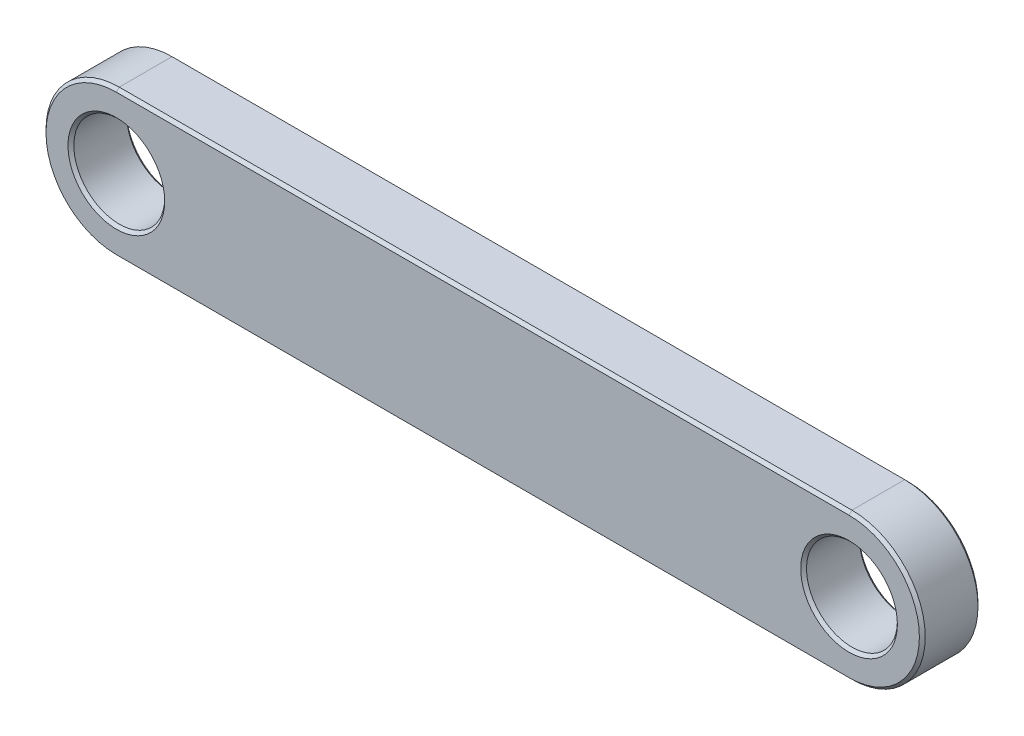
ISO-10303-21;
HEADER;
FILE_DESCRIPTION(('STEP AP214'),'2;1');
FILE_NAME('part.step','',(''),(''),'','','');
FILE_SCHEMA(('AUTOMOTIVE_DESIGN { 1 0 10303 214 1 1 1 1 }'));
ENDSEC;
DATA;
#1=APPLICATION_CONTEXT('core data for automotive mechanical design processes');
#2=APPLICATION_PROTOCOL_DEFINITION('international standard','automotive_design',2000,#1);
#3=PRODUCT_CONTEXT('',#1,'mechanical');
#4=PRODUCT('Part','Part','',(#3));
#5=PRODUCT_RELATED_PRODUCT_CATEGORY('part','',(#4));
#6=PRODUCT_DEFINITION_FORMATION('','',#4);
#7=PRODUCT_DEFINITION_CONTEXT('part definition',#1,'design');
#8=PRODUCT_DEFINITION('design','',#6,#7);
#9=PRODUCT_DEFINITION_SHAPE('','',#8);
#10=(LENGTH_UNIT() NAMED_UNIT(*) SI_UNIT(.MILLI.,.METRE.));
#11=(NAMED_UNIT(*) PLANE_ANGLE_UNIT() SI_UNIT($,.RADIAN.));
#12=(NAMED_UNIT(*) SI_UNIT($,.STERADIAN.) SOLID_ANGLE_UNIT());
#13=UNCERTAINTY_MEASURE_WITH_UNIT(LENGTH_MEASURE(1.E-05),#10,'distance_accuracy_value','');
#14=(GEOMETRIC_REPRESENTATION_CONTEXT(3) GLOBAL_UNCERTAINTY_ASSIGNED_CONTEXT((#13)) GLOBAL_UNIT_ASSIGNED_CONTEXT((#10,
#11,#12)) REPRESENTATION_CONTEXT('',''));
#15=CARTESIAN_POINT('',(0.,0.,0.));
#16=DIRECTION('',(0.,0.,1.));
#17=DIRECTION('',(1.,0.,0.));
#18=AXIS2_PLACEMENT_3D('',#15,#16,#17);
#19=CARTESIAN_POINT('',(-12.5,0.,2.));
#20=DIRECTION('',(0.,0.,1.));
#21=DIRECTION('',(1.,0.,0.));
#22=AXIS2_PLACEMENT_3D('',#19,#20,#21);
#23=PLANE('',#22);
#24=CARTESIAN_POINT('',(12.5,0.,2.));
#25=DIRECTION('',(0.,0.,1.));
#26=DIRECTION('',(1.,0.,0.));
#27=AXIS2_PLACEMENT_3D('',#24,#25,#26);
#28=CIRCLE('',#27,1.65);
#29=CARTESIAN_POINT('',(14.15,0.,2.));
#30=VERTEX_POINT('',#29);
#31=EDGE_CURVE('E11',#30,#30,#28,.F.);
#32=ORIENTED_EDGE('',*,*,#31,.T.);
#33=EDGE_LOOP('',(#32));
#34=FACE_BOUND('',#33,.T.);
#35=CARTESIAN_POINT('',(12.5,0.,2.));
#36=DIRECTION('',(0.,0.,1.));
#37=DIRECTION('',(1.,0.,0.));
#38=AXIS2_PLACEMENT_3D('',#35,#36,#37);
#39=CIRCLE('',#38,2.39999999999999);
#40=CARTESIAN_POINT('',(12.5,-2.39999999999999,2.));
#41=VERTEX_POINT('',#40);
#42=CARTESIAN_POINT('',(12.5,2.39999999999999,2.));
#43=VERTEX_POINT('',#42);
#44=EDGE_CURVE('E53',#41,#43,#39,.T.);
#45=ORIENTED_EDGE('',*,*,#44,.T.);
#46=DIRECTION('',(-1.,0.,0.));
#47=VECTOR('',#46,1.);
#48=CARTESIAN_POINT('',(-12.5,2.39999999999999,2.));
#49=LINE('',#48,#47);
#50=CARTESIAN_POINT('',(-12.5,2.39999999999999,2.));
#51=VERTEX_POINT('',#50);
#52=EDGE_CURVE('E45',#43,#51,#49,.T.);
#53=ORIENTED_EDGE('',*,*,#52,.T.);
#54=CARTESIAN_POINT('',(-12.5,0.,2.));
#55=DIRECTION('',(0.,0.,1.));
#56=DIRECTION('',(1.,0.,0.));
#57=AXIS2_PLACEMENT_3D('',#54,#55,#56);
#58=CIRCLE('',#57,2.39999999999999);
#59=CARTESIAN_POINT('',(-12.5,-2.39999999999999,2.));
#60=VERTEX_POINT('',#59);
#61=EDGE_CURVE('E171',#51,#60,#58,.T.);
#62=ORIENTED_EDGE('',*,*,#61,.T.);
#63=DIRECTION('',(1.,0.,0.));
#64=VECTOR('',#63,1.);
#65=CARTESIAN_POINT('',(12.5,-2.39999999999999,2.));
#66=LINE('',#65,#64);
#67=EDGE_CURVE('E58',#60,#41,#66,.T.);
#68=ORIENTED_EDGE('',*,*,#67,.T.);
#69=EDGE_LOOP('',(#45,#53,#62,#68));
#70=FACE_BOUND('',#69,.T.);
#71=CARTESIAN_POINT('',(-12.5,0.,2.));
#72=DIRECTION('',(0.,0.,1.));
#73=DIRECTION('',(1.,0.,0.));
#74=AXIS2_PLACEMENT_3D('',#71,#72,#73);
#75=CIRCLE('',#74,1.65);
#76=CARTESIAN_POINT('',(-10.85,0.,2.));
#77=VERTEX_POINT('',#76);
#78=EDGE_CURVE('E168',#77,#77,#75,.F.);
#79=ORIENTED_EDGE('',*,*,#78,.T.);
#80=EDGE_LOOP('',(#79));
#81=FACE_BOUND('',#80,.T.);
#82=ADVANCED_FACE('F35',(#34,#70,#81),#23,.T.);
#83=CARTESIAN_POINT('',(-12.5,0.,0.));
#84=DIRECTION('',(0.,0.,1.));
#85=DIRECTION('',(1.,0.,0.));
#86=AXIS2_PLACEMENT_3D('',#83,#84,#85);
#87=PLANE('',#86);
#88=CARTESIAN_POINT('',(12.5,0.,0.));
#89=DIRECTION('',(0.,0.,1.));
#90=DIRECTION('',(1.,0.,0.));
#91=AXIS2_PLACEMENT_3D('',#88,#89,#90);
#92=CIRCLE('',#91,1.65);
#93=CARTESIAN_POINT('',(14.15,0.,0.));
#94=VERTEX_POINT('',#93);
#95=EDGE_CURVE('E133',#94,#94,#92,.T.);
#96=ORIENTED_EDGE('',*,*,#95,.T.);
#97=EDGE_LOOP('',(#96));
#98=FACE_BOUND('',#97,.T.);
#99=CARTESIAN_POINT('',(-12.5,0.,0.));
#100=DIRECTION('',(0.,0.,1.));
#101=DIRECTION('',(1.,0.,0.));
#102=AXIS2_PLACEMENT_3D('',#99,#100,#101);
#103=CIRCLE('',#102,1.65);
#104=CARTESIAN_POINT('',(-10.85,0.,0.));
#105=VERTEX_POINT('',#104);
#106=EDGE_CURVE('E130',#105,#105,#103,.T.);
#107=ORIENTED_EDGE('',*,*,#106,.T.);
#108=EDGE_LOOP('',(#107));
#109=FACE_BOUND('',#108,.T.);
#110=CARTESIAN_POINT('',(12.5,0.,0.));
#111=DIRECTION('',(0.,0.,1.));
#112=DIRECTION('',(1.,0.,0.));
#113=AXIS2_PLACEMENT_3D('',#110,#111,#112);
#114=CIRCLE('',#113,2.40000000000001);
#115=CARTESIAN_POINT('',(12.5,2.40000000000001,0.));
#116=VERTEX_POINT('',#115);
#117=CARTESIAN_POINT('',(12.5,-2.40000000000001,0.));
#118=VERTEX_POINT('',#117);
#119=EDGE_CURVE('E129',#116,#118,#114,.F.);
#120=ORIENTED_EDGE('',*,*,#119,.T.);
#121=DIRECTION('',(-1.,0.,0.));
#122=VECTOR('',#121,1.);
#123=CARTESIAN_POINT('',(-12.5,-2.40000000000001,0.));
#124=LINE('',#123,#122);
#125=CARTESIAN_POINT('',(-12.5,-2.40000000000001,0.));
#126=VERTEX_POINT('',#125);
#127=EDGE_CURVE('E108',#118,#126,#124,.T.);
#128=ORIENTED_EDGE('',*,*,#127,.T.);
#129=CARTESIAN_POINT('',(-12.5,0.,0.));
#130=DIRECTION('',(0.,0.,1.));
#131=DIRECTION('',(1.,0.,0.));
#132=AXIS2_PLACEMENT_3D('',#129,#130,#131);
#133=CIRCLE('',#132,2.40000000000001);
#134=CARTESIAN_POINT('',(-12.5,2.40000000000001,0.));
#135=VERTEX_POINT('',#134);
#136=EDGE_CURVE('E118',#126,#135,#133,.F.);
#137=ORIENTED_EDGE('',*,*,#136,.T.);
#138=DIRECTION('',(1.,0.,0.));
#139=VECTOR('',#138,1.);
#140=CARTESIAN_POINT('',(-12.5,2.40000000000001,0.));
#141=LINE('',#140,#139);
#142=EDGE_CURVE('E124',#135,#116,#141,.T.);
#143=ORIENTED_EDGE('',*,*,#142,.T.);
#144=EDGE_LOOP('',(#120,#128,#137,#143));
#145=FACE_BOUND('',#144,.T.);
#146=ADVANCED_FACE('F127',(#98,#109,#145),#87,.F.);
#147=CARTESIAN_POINT('',(-12.5,0.,2.));
#148=DIRECTION('',(0.,0.,-1.));
#149=DIRECTION('',(-1.,0.,0.));
#150=AXIS2_PLACEMENT_3D('',#147,#148,#149);
#151=CYLINDRICAL_SURFACE('',#150,2.5);
#152=DIRECTION('',(0.,0.,-1.));
#153=VECTOR('',#152,1.);
#154=CARTESIAN_POINT('',(-12.5,2.5,2.));
#155=LINE('',#154,#153);
#156=CARTESIAN_POINT('',(-12.5,2.5,1.89999999999999));
#157=VERTEX_POINT('',#156);
#158=CARTESIAN_POINT('',(-12.5,2.5,0.099999999999992));
#159=VERTEX_POINT('',#158);
#160=EDGE_CURVE('E180',#157,#159,#155,.T.);
#161=ORIENTED_EDGE('',*,*,#160,.T.);
#162=CARTESIAN_POINT('',(-12.5,0.,0.099999999999992));
#163=DIRECTION('',(0.,0.,1.));
#164=DIRECTION('',(1.,0.,0.));
#165=AXIS2_PLACEMENT_3D('',#162,#163,#164);
#166=CIRCLE('',#165,2.5);
#167=CARTESIAN_POINT('',(-12.5,-2.5,0.099999999999992));
#168=VERTEX_POINT('',#167);
#169=EDGE_CURVE('E166',#159,#168,#166,.T.);
#170=ORIENTED_EDGE('',*,*,#169,.T.);
#171=DIRECTION('',(0.,0.,-1.));
#172=VECTOR('',#171,1.);
#173=CARTESIAN_POINT('',(-12.5,-2.5,2.));
#174=LINE('',#173,#172);
#175=CARTESIAN_POINT('',(-12.5,-2.5,1.89999999999999));
#176=VERTEX_POINT('',#175);
#177=EDGE_CURVE('E125',#176,#168,#174,.T.);
#178=ORIENTED_EDGE('',*,*,#177,.F.);
#179=CARTESIAN_POINT('',(-12.5,0.,1.89999999999999));
#180=DIRECTION('',(0.,0.,1.));
#181=DIRECTION('',(1.,0.,0.));
#182=AXIS2_PLACEMENT_3D('',#179,#180,#181);
#183=CIRCLE('',#182,2.5);
#184=EDGE_CURVE('E164',#176,#157,#183,.F.);
#185=ORIENTED_EDGE('',*,*,#184,.T.);
#186=EDGE_LOOP('',(#161,#170,#178,#185));
#187=FACE_BOUND('',#186,.T.);
#188=ADVANCED_FACE('F206',(#187),#151,.T.);
#189=CARTESIAN_POINT('',(-12.5,-2.5,2.));
#190=DIRECTION('',(0.,1.,0.));
#191=DIRECTION('',(-1.,0.,0.));
#192=AXIS2_PLACEMENT_3D('',#189,#190,#191);
#193=PLANE('',#192);
#194=ORIENTED_EDGE('',*,*,#177,.T.);
#195=DIRECTION('',(1.,0.,0.));
#196=VECTOR('',#195,1.);
#197=CARTESIAN_POINT('',(-12.5,-2.5,0.099999999999992));
#198=LINE('',#197,#196);
#199=CARTESIAN_POINT('',(12.5,-2.5,0.099999999999992));
#200=VERTEX_POINT('',#199);
#201=EDGE_CURVE('E111',#168,#200,#198,.T.);
#202=ORIENTED_EDGE('',*,*,#201,.T.);
#203=DIRECTION('',(0.,0.,-1.));
#204=VECTOR('',#203,1.);
#205=CARTESIAN_POINT('',(12.5,-2.5,2.));
#206=LINE('',#205,#204);
#207=CARTESIAN_POINT('',(12.5,-2.5,1.89999999999999));
#208=VERTEX_POINT('',#207);
#209=EDGE_CURVE('E203',#208,#200,#206,.T.);
#210=ORIENTED_EDGE('',*,*,#209,.F.);
#211=DIRECTION('',(-1.,0.,0.));
#212=VECTOR('',#211,1.);
#213=CARTESIAN_POINT('',(-12.5,-2.5,1.89999999999999));
#214=LINE('',#213,#212);
#215=EDGE_CURVE('E152',#208,#176,#214,.T.);
#216=ORIENTED_EDGE('',*,*,#215,.T.);
#217=EDGE_LOOP('',(#194,#202,#210,#216));
#218=FACE_BOUND('',#217,.T.);
#219=ADVANCED_FACE('F201',(#218),#193,.F.);
#220=CARTESIAN_POINT('',(12.5,0.,2.));
#221=DIRECTION('',(0.,0.,-1.));
#222=DIRECTION('',(-1.,0.,0.));
#223=AXIS2_PLACEMENT_3D('',#220,#221,#222);
#224=CYLINDRICAL_SURFACE('',#223,2.5);
#225=ORIENTED_EDGE('',*,*,#209,.T.);
#226=CARTESIAN_POINT('',(12.5,0.,0.099999999999992));
#227=DIRECTION('',(0.,0.,1.));
#228=DIRECTION('',(1.,0.,0.));
#229=AXIS2_PLACEMENT_3D('',#226,#227,#228);
#230=CIRCLE('',#229,2.5);
#231=CARTESIAN_POINT('',(12.5,2.5,0.099999999999992));
#232=VERTEX_POINT('',#231);
#233=EDGE_CURVE('E157',#200,#232,#230,.T.);
#234=ORIENTED_EDGE('',*,*,#233,.T.);
#235=DIRECTION('',(0.,0.,-1.));
#236=VECTOR('',#235,1.);
#237=CARTESIAN_POINT('',(12.5,2.5,2.));
#238=LINE('',#237,#236);
#239=CARTESIAN_POINT('',(12.5,2.5,1.89999999999999));
#240=VERTEX_POINT('',#239);
#241=EDGE_CURVE('E209',#240,#232,#238,.T.);
#242=ORIENTED_EDGE('',*,*,#241,.F.);
#243=CARTESIAN_POINT('',(12.5,0.,1.89999999999999));
#244=DIRECTION('',(0.,0.,1.));
#245=DIRECTION('',(1.,0.,0.));
#246=AXIS2_PLACEMENT_3D('',#243,#244,#245);
#247=CIRCLE('',#246,2.5);
#248=EDGE_CURVE('E155',#240,#208,#247,.F.);
#249=ORIENTED_EDGE('',*,*,#248,.T.);
#250=EDGE_LOOP('',(#225,#234,#242,#249));
#251=FACE_BOUND('',#250,.T.);
#252=ADVANCED_FACE('F222',(#251),#224,.T.);
#253=CARTESIAN_POINT('',(-12.5,2.5,2.));
#254=DIRECTION('',(0.,-1.,0.));
#255=DIRECTION('',(1.,0.,0.));
#256=AXIS2_PLACEMENT_3D('',#253,#254,#255);
#257=PLANE('',#256);
#258=ORIENTED_EDGE('',*,*,#241,.T.);
#259=DIRECTION('',(-1.,0.,0.));
#260=VECTOR('',#259,1.);
#261=CARTESIAN_POINT('',(-12.5,2.5,0.099999999999992));
#262=LINE('',#261,#260);
#263=EDGE_CURVE('E162',#232,#159,#262,.T.);
#264=ORIENTED_EDGE('',*,*,#263,.T.);
#265=ORIENTED_EDGE('',*,*,#160,.F.);
#266=DIRECTION('',(1.,0.,0.));
#267=VECTOR('',#266,1.);
#268=CARTESIAN_POINT('',(12.5,2.5,1.89999999999999));
#269=LINE('',#268,#267);
#270=EDGE_CURVE('E159',#157,#240,#269,.T.);
#271=ORIENTED_EDGE('',*,*,#270,.T.);
#272=EDGE_LOOP('',(#258,#264,#265,#271));
#273=FACE_BOUND('',#272,.T.);
#274=ADVANCED_FACE('F226',(#273),#257,.F.);
#275=CARTESIAN_POINT('',(-12.5,0.,2.));
#276=DIRECTION('',(0.,0.,-1.));
#277=DIRECTION('',(-1.,0.,0.));
#278=AXIS2_PLACEMENT_3D('',#275,#276,#277);
#279=CYLINDRICAL_SURFACE('',#278,1.55);
#280=CARTESIAN_POINT('',(-12.5,0.,0.0999999999999977));
#281=DIRECTION('',(0.,0.,1.));
#282=DIRECTION('',(1.,0.,0.));
#283=AXIS2_PLACEMENT_3D('',#280,#281,#282);
#284=CIRCLE('',#283,1.55);
#285=CARTESIAN_POINT('',(-10.95,0.,0.0999999999999977));
#286=VERTEX_POINT('',#285);
#287=EDGE_CURVE('E149',#286,#286,#284,.F.);
#288=ORIENTED_EDGE('',*,*,#287,.T.);
#289=EDGE_LOOP('',(#288));
#290=FACE_BOUND('',#289,.T.);
#291=CARTESIAN_POINT('',(-12.5,0.,1.9));
#292=DIRECTION('',(0.,0.,1.));
#293=DIRECTION('',(1.,0.,0.));
#294=AXIS2_PLACEMENT_3D('',#291,#292,#293);
#295=CIRCLE('',#294,1.55);
#296=CARTESIAN_POINT('',(-10.95,0.,1.9));
#297=VERTEX_POINT('',#296);
#298=EDGE_CURVE('E146',#297,#297,#295,.T.);
#299=ORIENTED_EDGE('',*,*,#298,.T.);
#300=EDGE_LOOP('',(#299));
#301=FACE_BOUND('',#300,.T.);
#302=ADVANCED_FACE('F242',(#290,#301),#279,.F.);
#303=CARTESIAN_POINT('',(12.5,0.,2.));
#304=DIRECTION('',(0.,0.,-1.));
#305=DIRECTION('',(-1.,0.,0.));
#306=AXIS2_PLACEMENT_3D('',#303,#304,#305);
#307=CYLINDRICAL_SURFACE('',#306,1.55);
#308=CARTESIAN_POINT('',(12.5,0.,0.100000000000001));
#309=DIRECTION('',(0.,0.,1.));
#310=DIRECTION('',(1.,0.,0.));
#311=AXIS2_PLACEMENT_3D('',#308,#309,#310);
#312=CIRCLE('',#311,1.55);
#313=CARTESIAN_POINT('',(14.05,0.,0.100000000000001));
#314=VERTEX_POINT('',#313);
#315=EDGE_CURVE('E143',#314,#314,#312,.F.);
#316=ORIENTED_EDGE('',*,*,#315,.T.);
#317=EDGE_LOOP('',(#316));
#318=FACE_BOUND('',#317,.T.);
#319=CARTESIAN_POINT('',(12.5,0.,1.9));
#320=DIRECTION('',(0.,0.,1.));
#321=DIRECTION('',(1.,0.,0.));
#322=AXIS2_PLACEMENT_3D('',#319,#320,#321);
#323=CIRCLE('',#322,1.55);
#324=CARTESIAN_POINT('',(14.05,0.,1.9));
#325=VERTEX_POINT('',#324);
#326=EDGE_CURVE('E140',#325,#325,#323,.T.);
#327=ORIENTED_EDGE('',*,*,#326,.T.);
#328=EDGE_LOOP('',(#327));
#329=FACE_BOUND('',#328,.T.);
#330=ADVANCED_FACE('F244',(#318,#329),#307,.F.);
#331=CARTESIAN_POINT('',(12.5,0.,0.));
#332=DIRECTION('',(0.,0.,-1.));
#333=DIRECTION('',(-1.,0.,0.));
#334=AXIS2_PLACEMENT_3D('',#331,#332,#333);
#335=CONICAL_SURFACE('',#334,1.65,0.785398163397456);
#336=ORIENTED_EDGE('',*,*,#315,.F.);
#337=EDGE_LOOP('',(#336));
#338=FACE_BOUND('',#337,.T.);
#339=ORIENTED_EDGE('',*,*,#95,.F.);
#340=EDGE_LOOP('',(#339));
#341=FACE_BOUND('',#340,.T.);
#342=ADVANCED_FACE('F251',(#338,#341),#335,.F.);
#343=CARTESIAN_POINT('',(-12.5,0.,0.));
#344=DIRECTION('',(0.,0.,-1.));
#345=DIRECTION('',(-1.,0.,0.));
#346=AXIS2_PLACEMENT_3D('',#343,#344,#345);
#347=CONICAL_SURFACE('',#346,1.65,0.785398163397439);
#348=ORIENTED_EDGE('',*,*,#287,.F.);
#349=EDGE_LOOP('',(#348));
#350=FACE_BOUND('',#349,.T.);
#351=ORIENTED_EDGE('',*,*,#106,.F.);
#352=EDGE_LOOP('',(#351));
#353=FACE_BOUND('',#352,.T.);
#354=ADVANCED_FACE('F271',(#350,#353),#347,.F.);
#355=CARTESIAN_POINT('',(-12.5,2.5,0.099999999999992));
#356=DIRECTION('',(0.,-0.707106781186552,0.707106781186543));
#357=DIRECTION('',(-1.,0.,0.));
#358=AXIS2_PLACEMENT_3D('',#355,#356,#357);
#359=PLANE('',#358);
#360=DIRECTION('',(0.,0.707106781186543,0.707106781186552));
#361=VECTOR('',#360,1.);
#362=CARTESIAN_POINT('',(12.5,2.40000000000001,0.));
#363=LINE('',#362,#361);
#364=EDGE_CURVE('E114',#116,#232,#363,.T.);
#365=ORIENTED_EDGE('',*,*,#364,.F.);
#366=ORIENTED_EDGE('',*,*,#142,.F.);
#367=DIRECTION('',(0.,-0.707106781186543,-0.707106781186552));
#368=VECTOR('',#367,1.);
#369=CARTESIAN_POINT('',(-12.5,2.5,0.099999999999992));
#370=LINE('',#369,#368);
#371=EDGE_CURVE('E121',#159,#135,#370,.T.);
#372=ORIENTED_EDGE('',*,*,#371,.F.);
#373=ORIENTED_EDGE('',*,*,#263,.F.);
#374=EDGE_LOOP('',(#365,#366,#372,#373));
#375=FACE_BOUND('',#374,.T.);
#376=ADVANCED_FACE('F215',(#375),#359,.F.);
#377=CARTESIAN_POINT('',(-12.5,0.,0.099999999999992));
#378=DIRECTION('',(0.,0.,1.));
#379=DIRECTION('',(1.,0.,0.));
#380=AXIS2_PLACEMENT_3D('',#377,#378,#379);
#381=CONICAL_SURFACE('',#380,2.5,0.785398163397442);
#382=ORIENTED_EDGE('',*,*,#371,.T.);
#383=ORIENTED_EDGE('',*,*,#136,.F.);
#384=DIRECTION('',(0.,0.707106781186543,-0.707106781186552));
#385=VECTOR('',#384,1.);
#386=CARTESIAN_POINT('',(-12.5,-2.5,0.099999999999992));
#387=LINE('',#386,#385);
#388=EDGE_CURVE('E104',#168,#126,#387,.T.);
#389=ORIENTED_EDGE('',*,*,#388,.F.);
#390=ORIENTED_EDGE('',*,*,#169,.F.);
#391=EDGE_LOOP('',(#382,#383,#389,#390));
#392=FACE_BOUND('',#391,.T.);
#393=ADVANCED_FACE('F119',(#392),#381,.T.);
#394=CARTESIAN_POINT('',(12.5,0.,0.099999999999992));
#395=DIRECTION('',(0.,0.,1.));
#396=DIRECTION('',(1.,0.,0.));
#397=AXIS2_PLACEMENT_3D('',#394,#395,#396);
#398=CONICAL_SURFACE('',#397,2.5,0.785398163397442);
#399=ORIENTED_EDGE('',*,*,#364,.T.);
#400=ORIENTED_EDGE('',*,*,#233,.F.);
#401=DIRECTION('',(0.,-0.707106781186543,0.707106781186552));
#402=VECTOR('',#401,1.);
#403=CARTESIAN_POINT('',(12.5,-2.40000000000001,0.));
#404=LINE('',#403,#402);
#405=EDGE_CURVE('E115',#118,#200,#404,.T.);
#406=ORIENTED_EDGE('',*,*,#405,.F.);
#407=ORIENTED_EDGE('',*,*,#119,.F.);
#408=EDGE_LOOP('',(#399,#400,#406,#407));
#409=FACE_BOUND('',#408,.T.);
#410=ADVANCED_FACE('F218',(#409),#398,.T.);
#411=CARTESIAN_POINT('',(-12.5,-2.5,0.099999999999992));
#412=DIRECTION('',(0.,0.707106781186552,0.707106781186543));
#413=DIRECTION('',(1.,0.,0.));
#414=AXIS2_PLACEMENT_3D('',#411,#412,#413);
#415=PLANE('',#414);
#416=ORIENTED_EDGE('',*,*,#388,.T.);
#417=ORIENTED_EDGE('',*,*,#127,.F.);
#418=ORIENTED_EDGE('',*,*,#405,.T.);
#419=ORIENTED_EDGE('',*,*,#201,.F.);
#420=EDGE_LOOP('',(#416,#417,#418,#419));
#421=FACE_BOUND('',#420,.T.);
#422=ADVANCED_FACE('F106',(#421),#415,.F.);
#423=CARTESIAN_POINT('',(12.5,0.,1.9));
#424=DIRECTION('',(0.,0.,1.));
#425=DIRECTION('',(1.,0.,0.));
#426=AXIS2_PLACEMENT_3D('',#423,#424,#425);
#427=CONICAL_SURFACE('',#426,1.55,0.785398163397459);
#428=CARTESIAN_POINT('',(14.15,0.,2.));
#429=CARTESIAN_POINT('',(14.1489583333333,0.,1.99895833333333));
#430=CARTESIAN_POINT('',(14.1479166666667,0.,1.99791666666667));
#431=CARTESIAN_POINT('',(14.1458333333333,0.,1.99583333333333));
#432=CARTESIAN_POINT('',(14.1447916666667,0.,1.99479166666667));
#433=CARTESIAN_POINT('',(14.1427083333333,0.,1.99270833333333));
#434=CARTESIAN_POINT('',(14.1416666666667,0.,1.99166666666667));
#435=CARTESIAN_POINT('',(14.1395833333333,0.,1.98958333333333));
#436=CARTESIAN_POINT('',(14.1385416666667,0.,1.98854166666667));
#437=CARTESIAN_POINT('',(14.1364583333333,0.,1.98645833333333));
#438=CARTESIAN_POINT('',(14.1354166666667,0.,1.98541666666667));
#439=CARTESIAN_POINT('',(14.1333333333333,0.,1.98333333333333));
#440=CARTESIAN_POINT('',(14.1322916666667,0.,1.98229166666667));
#441=CARTESIAN_POINT('',(14.1302083333333,0.,1.98020833333333));
#442=CARTESIAN_POINT('',(14.1291666666667,0.,1.97916666666667));
#443=CARTESIAN_POINT('',(14.1270833333333,0.,1.97708333333333));
#444=CARTESIAN_POINT('',(14.1260416666667,0.,1.97604166666667));
#445=CARTESIAN_POINT('',(14.1239583333333,0.,1.97395833333333));
#446=CARTESIAN_POINT('',(14.1229166666667,0.,1.97291666666667));
#447=CARTESIAN_POINT('',(14.1208333333333,0.,1.97083333333333));
#448=CARTESIAN_POINT('',(14.1197916666667,0.,1.96979166666667));
#449=CARTESIAN_POINT('',(14.1177083333333,0.,1.96770833333333));
#450=CARTESIAN_POINT('',(14.1166666666667,0.,1.96666666666667));
#451=CARTESIAN_POINT('',(14.1145833333333,0.,1.96458333333333));
#452=CARTESIAN_POINT('',(14.1135416666667,0.,1.96354166666667));
#453=CARTESIAN_POINT('',(14.1114583333333,0.,1.96145833333333));
#454=CARTESIAN_POINT('',(14.1104166666667,0.,1.96041666666667));
#455=CARTESIAN_POINT('',(14.1083333333333,0.,1.95833333333333));
#456=CARTESIAN_POINT('',(14.1072916666667,0.,1.95729166666667));
#457=CARTESIAN_POINT('',(14.1052083333333,0.,1.95520833333333));
#458=CARTESIAN_POINT('',(14.1041666666667,0.,1.95416666666667));
#459=CARTESIAN_POINT('',(14.1020833333333,0.,1.95208333333333));
#460=CARTESIAN_POINT('',(14.1010416666667,0.,1.95104166666667));
#461=CARTESIAN_POINT('',(14.0989583333333,0.,1.94895833333333));
#462=CARTESIAN_POINT('',(14.0979166666667,0.,1.94791666666667));
#463=CARTESIAN_POINT('',(14.0958333333333,0.,1.94583333333333));
#464=CARTESIAN_POINT('',(14.0947916666667,0.,1.94479166666667));
#465=CARTESIAN_POINT('',(14.0927083333333,0.,1.94270833333333));
#466=CARTESIAN_POINT('',(14.0916666666667,0.,1.94166666666667));
#467=CARTESIAN_POINT('',(14.0895833333333,0.,1.93958333333334));
#468=CARTESIAN_POINT('',(14.0885416666667,0.,1.93854166666667));
#469=CARTESIAN_POINT('',(14.0864583333333,0.,1.93645833333333));
#470=CARTESIAN_POINT('',(14.0854166666667,0.,1.93541666666667));
#471=CARTESIAN_POINT('',(14.0833333333333,0.,1.93333333333334));
#472=CARTESIAN_POINT('',(14.0822916666667,0.,1.93229166666667));
#473=CARTESIAN_POINT('',(14.0802083333333,0.,1.93020833333334));
#474=CARTESIAN_POINT('',(14.0791666666667,0.,1.92916666666667));
#475=CARTESIAN_POINT('',(14.0770833333333,0.,1.92708333333334));
#476=CARTESIAN_POINT('',(14.0760416666667,0.,1.92604166666667));
#477=CARTESIAN_POINT('',(14.0739583333333,0.,1.92395833333334));
#478=CARTESIAN_POINT('',(14.0729166666667,0.,1.92291666666667));
#479=CARTESIAN_POINT('',(14.0708333333333,0.,1.92083333333334));
#480=CARTESIAN_POINT('',(14.0697916666667,0.,1.91979166666667));
#481=CARTESIAN_POINT('',(14.0677083333333,0.,1.91770833333334));
#482=CARTESIAN_POINT('',(14.0666666666667,0.,1.91666666666667));
#483=CARTESIAN_POINT('',(14.0645833333333,0.,1.91458333333334));
#484=CARTESIAN_POINT('',(14.0635416666667,0.,1.91354166666667));
#485=CARTESIAN_POINT('',(14.0614583333333,0.,1.91145833333334));
#486=CARTESIAN_POINT('',(14.0604166666667,0.,1.91041666666667));
#487=CARTESIAN_POINT('',(14.0583333333333,0.,1.90833333333334));
#488=CARTESIAN_POINT('',(14.0572916666667,0.,1.90729166666667));
#489=CARTESIAN_POINT('',(14.0552083333333,0.,1.90520833333334));
#490=CARTESIAN_POINT('',(14.0541666666667,0.,1.90416666666667));
#491=CARTESIAN_POINT('',(14.0520833333333,0.,1.90208333333334));
#492=CARTESIAN_POINT('',(14.0510416666667,0.,1.90104166666667));
#493=CARTESIAN_POINT('',(14.05,0.,1.9));
#494=B_SPLINE_CURVE_WITH_KNOTS('',3,(#428,#429,#430,#431,#432,#433,#434,#435,#436,#437,#438,
#439,#440,#441,#442,#443,#444,#445,#446,#447,#448,#449,#450,#451,#452,#453,#454,#455,#456,#457,
#458,#459,#460,#461,#462,#463,#464,#465,#466,#467,#468,#469,#470,#471,#472,#473,#474,#475,#476,
#477,#478,#479,#480,#481,#482,#483,#484,#485,#486,#487,#488,#489,#490,#491,#492,#493),
.UNSPECIFIED.,.F.,.F.,(4,2,2,2,2,2,2,2,2,2,2,2,2,2,2,2,2,2,2,2,2,2,2,2,2,2,2,2,2,2,2,2,4),(0.,
0.00441941738241544,0.00883883476483118,0.0132582521472478,0.0176776695296636,0.022097086912079,
0.0265165042944948,0.0309359216769105,0.0353553390593272,0.0397747564417429,0.0441941738241583,
0.0486135912065741,0.0530330085889895,0.0574524259714053,0.0618718433538219,0.0662912607362377,
0.0707106781186533,0.0751300955010688,0.0795495128834846,0.0839689302659014,0.088388347648317,
0.0928077650307326,0.0972271824131481,0.101646599795564,0.106066017177979,0.110485434560396,
0.114904851942812,0.119324269325227,0.123743686707643,0.128163104090059,0.132582521472475,
0.137001938854891,0.141421356237307),.UNSPECIFIED.);
#495=EDGE_CURVE('BSEAM286',#30,#325,#494,.T.);
#496=ORIENTED_EDGE('',*,*,#31,.F.);
#497=ORIENTED_EDGE('',*,*,#326,.F.);
#498=ORIENTED_EDGE('',*,*,#495,.T.);
#499=ORIENTED_EDGE('',*,*,#495,.F.);
#500=EDGE_LOOP('',(#496,#498,#497,#499));
#501=FACE_BOUND('',#500,.T.);
#502=ADVANCED_FACE('F286',(#501),#427,.F.);
#503=CARTESIAN_POINT('',(-12.5,-2.39999999999999,2.));
#504=DIRECTION('',(0.,-0.70710678118654,0.707106781186555));
#505=DIRECTION('',(-1.,0.,0.));
#506=AXIS2_PLACEMENT_3D('',#503,#504,#505);
#507=PLANE('',#506);
#508=DIRECTION('',(0.,0.707106781186555,0.70710678118654));
#509=VECTOR('',#508,1.);
#510=CARTESIAN_POINT('',(-12.5,-2.5,1.89999999999999));
#511=LINE('',#510,#509);
#512=EDGE_CURVE('E184',#176,#60,#511,.T.);
#513=ORIENTED_EDGE('',*,*,#512,.F.);
#514=ORIENTED_EDGE('',*,*,#215,.F.);
#515=DIRECTION('',(0.,-0.707106781186555,-0.70710678118654));
#516=VECTOR('',#515,1.);
#517=CARTESIAN_POINT('',(12.5,-2.39999999999999,2.));
#518=LINE('',#517,#516);
#519=EDGE_CURVE('E40',#41,#208,#518,.T.);
#520=ORIENTED_EDGE('',*,*,#519,.F.);
#521=ORIENTED_EDGE('',*,*,#67,.F.);
#522=EDGE_LOOP('',(#513,#514,#520,#521));
#523=FACE_BOUND('',#522,.T.);
#524=ADVANCED_FACE('F196',(#523),#507,.T.);
#525=CARTESIAN_POINT('',(12.5,0.,2.));
#526=DIRECTION('',(0.,0.,-1.));
#527=DIRECTION('',(-1.,0.,0.));
#528=AXIS2_PLACEMENT_3D('',#525,#526,#527);
#529=CONICAL_SURFACE('',#528,2.39999999999999,0.785398163397459);
#530=ORIENTED_EDGE('',*,*,#519,.T.);
#531=ORIENTED_EDGE('',*,*,#248,.F.);
#532=DIRECTION('',(0.,0.707106781186555,-0.70710678118654));
#533=VECTOR('',#532,1.);
#534=CARTESIAN_POINT('',(12.5,2.39999999999999,2.));
#535=LINE('',#534,#533);
#536=EDGE_CURVE('E183',#43,#240,#535,.T.);
#537=ORIENTED_EDGE('',*,*,#536,.F.);
#538=ORIENTED_EDGE('',*,*,#44,.F.);
#539=EDGE_LOOP('',(#530,#531,#537,#538));
#540=FACE_BOUND('',#539,.T.);
#541=ADVANCED_FACE('F193',(#540),#529,.T.);
#542=CARTESIAN_POINT('',(-12.5,0.,2.));
#543=DIRECTION('',(0.,0.,-1.));
#544=DIRECTION('',(-1.,0.,0.));
#545=AXIS2_PLACEMENT_3D('',#542,#543,#544);
#546=CONICAL_SURFACE('',#545,2.39999999999999,0.785398163397459);
#547=ORIENTED_EDGE('',*,*,#512,.T.);
#548=ORIENTED_EDGE('',*,*,#61,.F.);
#549=DIRECTION('',(0.,-0.707106781186555,0.70710678118654));
#550=VECTOR('',#549,1.);
#551=CARTESIAN_POINT('',(-12.5,2.5,1.89999999999999));
#552=LINE('',#551,#550);
#553=EDGE_CURVE('E181',#157,#51,#552,.T.);
#554=ORIENTED_EDGE('',*,*,#553,.F.);
#555=ORIENTED_EDGE('',*,*,#184,.F.);
#556=EDGE_LOOP('',(#547,#548,#554,#555));
#557=FACE_BOUND('',#556,.T.);
#558=ADVANCED_FACE('F231',(#557),#546,.T.);
#559=CARTESIAN_POINT('',(-12.5,2.39999999999999,2.));
#560=DIRECTION('',(0.,0.70710678118654,0.707106781186555));
#561=DIRECTION('',(1.,0.,0.));
#562=AXIS2_PLACEMENT_3D('',#559,#560,#561);
#563=PLANE('',#562);
#564=ORIENTED_EDGE('',*,*,#536,.T.);
#565=ORIENTED_EDGE('',*,*,#270,.F.);
#566=ORIENTED_EDGE('',*,*,#553,.T.);
#567=ORIENTED_EDGE('',*,*,#52,.F.);
#568=EDGE_LOOP('',(#564,#565,#566,#567));
#569=FACE_BOUND('',#568,.T.);
#570=ADVANCED_FACE('F229',(#569),#563,.T.);
#571=CARTESIAN_POINT('',(-12.5,0.,1.9));
#572=DIRECTION('',(0.,0.,1.));
#573=DIRECTION('',(1.,0.,0.));
#574=AXIS2_PLACEMENT_3D('',#571,#572,#573);
#575=CONICAL_SURFACE('',#574,1.55,0.785398163397459);
#576=CARTESIAN_POINT('',(-10.85,0.,2.));
#577=CARTESIAN_POINT('',(-10.8510416666667,0.,1.99895833333333));
#578=CARTESIAN_POINT('',(-10.8520833333333,0.,1.99791666666667));
#579=CARTESIAN_POINT('',(-10.8541666666667,0.,1.99583333333333));
#580=CARTESIAN_POINT('',(-10.8552083333333,0.,1.99479166666667));
#581=CARTESIAN_POINT('',(-10.8572916666667,0.,1.99270833333333));
#582=CARTESIAN_POINT('',(-10.8583333333333,0.,1.99166666666667));
#583=CARTESIAN_POINT('',(-10.8604166666667,0.,1.98958333333333));
#584=CARTESIAN_POINT('',(-10.8614583333333,0.,1.98854166666667));
#585=CARTESIAN_POINT('',(-10.8635416666667,0.,1.98645833333333));
#586=CARTESIAN_POINT('',(-10.8645833333333,0.,1.98541666666667));
#587=CARTESIAN_POINT('',(-10.8666666666667,0.,1.98333333333333));
#588=CARTESIAN_POINT('',(-10.8677083333333,0.,1.98229166666667));
#589=CARTESIAN_POINT('',(-10.8697916666667,0.,1.98020833333333));
#590=CARTESIAN_POINT('',(-10.8708333333333,0.,1.97916666666667));
#591=CARTESIAN_POINT('',(-10.8729166666667,0.,1.97708333333333));
#592=CARTESIAN_POINT('',(-10.8739583333333,0.,1.97604166666667));
#593=CARTESIAN_POINT('',(-10.8760416666667,0.,1.97395833333333));
#594=CARTESIAN_POINT('',(-10.8770833333333,0.,1.97291666666667));
#595=CARTESIAN_POINT('',(-10.8791666666667,0.,1.97083333333333));
#596=CARTESIAN_POINT('',(-10.8802083333333,0.,1.96979166666667));
#597=CARTESIAN_POINT('',(-10.8822916666667,0.,1.96770833333333));
#598=CARTESIAN_POINT('',(-10.8833333333333,0.,1.96666666666667));
#599=CARTESIAN_POINT('',(-10.8854166666667,0.,1.96458333333333));
#600=CARTESIAN_POINT('',(-10.8864583333333,0.,1.96354166666667));
#601=CARTESIAN_POINT('',(-10.8885416666667,0.,1.96145833333333));
#602=CARTESIAN_POINT('',(-10.8895833333333,0.,1.96041666666667));
#603=CARTESIAN_POINT('',(-10.8916666666667,0.,1.95833333333333));
#604=CARTESIAN_POINT('',(-10.8927083333333,0.,1.95729166666667));
#605=CARTESIAN_POINT('',(-10.8947916666667,0.,1.95520833333333));
#606=CARTESIAN_POINT('',(-10.8958333333333,0.,1.95416666666667));
#607=CARTESIAN_POINT('',(-10.8979166666667,0.,1.95208333333333));
#608=CARTESIAN_POINT('',(-10.8989583333333,0.,1.95104166666667));
#609=CARTESIAN_POINT('',(-10.9010416666667,0.,1.94895833333333));
#610=CARTESIAN_POINT('',(-10.9020833333333,0.,1.94791666666667));
#611=CARTESIAN_POINT('',(-10.9041666666667,0.,1.94583333333333));
#612=CARTESIAN_POINT('',(-10.9052083333333,0.,1.94479166666667));
#613=CARTESIAN_POINT('',(-10.9072916666667,0.,1.94270833333333));
#614=CARTESIAN_POINT('',(-10.9083333333333,0.,1.94166666666667));
#615=CARTESIAN_POINT('',(-10.9104166666667,0.,1.93958333333334));
#616=CARTESIAN_POINT('',(-10.9114583333333,0.,1.93854166666667));
#617=CARTESIAN_POINT('',(-10.9135416666667,0.,1.93645833333333));
#618=CARTESIAN_POINT('',(-10.9145833333333,0.,1.93541666666667));
#619=CARTESIAN_POINT('',(-10.9166666666667,0.,1.93333333333334));
#620=CARTESIAN_POINT('',(-10.9177083333333,0.,1.93229166666667));
#621=CARTESIAN_POINT('',(-10.9197916666667,0.,1.93020833333334));
#622=CARTESIAN_POINT('',(-10.9208333333333,0.,1.92916666666667));
#623=CARTESIAN_POINT('',(-10.9229166666667,0.,1.92708333333334));
#624=CARTESIAN_POINT('',(-10.9239583333333,0.,1.92604166666667));
#625=CARTESIAN_POINT('',(-10.9260416666667,0.,1.92395833333334));
#626=CARTESIAN_POINT('',(-10.9270833333333,0.,1.92291666666667));
#627=CARTESIAN_POINT('',(-10.9291666666667,0.,1.92083333333334));
#628=CARTESIAN_POINT('',(-10.9302083333333,0.,1.91979166666667));
#629=CARTESIAN_POINT('',(-10.9322916666667,0.,1.91770833333334));
#630=CARTESIAN_POINT('',(-10.9333333333333,0.,1.91666666666667));
#631=CARTESIAN_POINT('',(-10.9354166666667,0.,1.91458333333334));
#632=CARTESIAN_POINT('',(-10.9364583333333,0.,1.91354166666667));
#633=CARTESIAN_POINT('',(-10.9385416666667,0.,1.91145833333334));
#634=CARTESIAN_POINT('',(-10.9395833333333,0.,1.91041666666667));
#635=CARTESIAN_POINT('',(-10.9416666666667,0.,1.90833333333334));
#636=CARTESIAN_POINT('',(-10.9427083333333,0.,1.90729166666667));
#637=CARTESIAN_POINT('',(-10.9447916666667,0.,1.90520833333334));
#638=CARTESIAN_POINT('',(-10.9458333333333,0.,1.90416666666667));
#639=CARTESIAN_POINT('',(-10.9479166666667,0.,1.90208333333334));
#640=CARTESIAN_POINT('',(-10.9489583333333,0.,1.90104166666667));
#641=CARTESIAN_POINT('',(-10.95,0.,1.9));
#642=B_SPLINE_CURVE_WITH_KNOTS('',3,(#576,#577,#578,#579,#580,#581,#582,#583,#584,#585,#586,
#587,#588,#589,#590,#591,#592,#593,#594,#595,#596,#597,#598,#599,#600,#601,#602,#603,#604,#605,
#606,#607,#608,#609,#610,#611,#612,#613,#614,#615,#616,#617,#618,#619,#620,#621,#622,#623,#624,
#625,#626,#627,#628,#629,#630,#631,#632,#633,#634,#635,#636,#637,#638,#639,#640,#641),
.UNSPECIFIED.,.F.,.F.,(4,2,2,2,2,2,2,2,2,2,2,2,2,2,2,2,2,2,2,2,2,2,2,2,2,2,2,2,2,2,2,2,4),(0.,
0.00441941738241544,0.00883883476483118,0.0132582521472478,0.0176776695296636,0.022097086912079,
0.0265165042944948,0.0309359216769105,0.0353553390593272,0.0397747564417429,0.0441941738241583,
0.0486135912065741,0.0530330085889895,0.0574524259714053,0.0618718433538219,0.0662912607362377,
0.0707106781186533,0.0751300955010688,0.0795495128834846,0.0839689302659014,0.088388347648317,
0.0928077650307326,0.0972271824131481,0.101646599795564,0.106066017177979,0.110485434560396,
0.114904851942812,0.119324269325227,0.123743686707643,0.128163104090059,0.132582521472475,
0.137001938854891,0.141421356237307),.UNSPECIFIED.);
#643=EDGE_CURVE('BSEAM38',#77,#297,#642,.T.);
#644=ORIENTED_EDGE('',*,*,#78,.F.);
#645=ORIENTED_EDGE('',*,*,#298,.F.);
#646=ORIENTED_EDGE('',*,*,#643,.T.);
#647=ORIENTED_EDGE('',*,*,#643,.F.);
#648=EDGE_LOOP('',(#644,#646,#645,#647));
#649=FACE_BOUND('',#648,.T.);
#650=ADVANCED_FACE('F38',(#649),#575,.F.);
#651=CLOSED_SHELL('',(#82,#146,#188,#219,#252,#274,#302,#330,#342,#354,#376,#393,#410,#422,#502,
#524,#541,#558,#570,#650));
#652=MANIFOLD_SOLID_BREP('B2',#651);
#653=ADVANCED_BREP_SHAPE_REPRESENTATION('',(#18,#652),#14);
#654=SHAPE_DEFINITION_REPRESENTATION(#9,#653);
ENDSEC;
END-ISO-10303-21;
